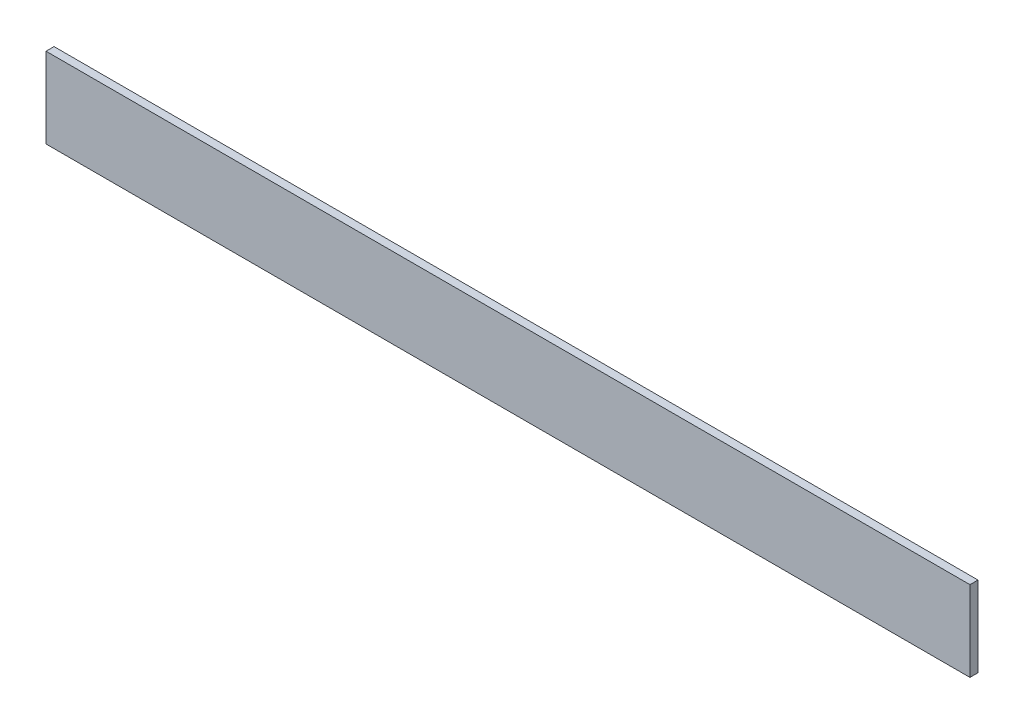
ISO-10303-21;
HEADER;
FILE_DESCRIPTION(('STEP AP214'),'2;1');
FILE_NAME('part.step','',(''),(''),'','','');
FILE_SCHEMA(('AUTOMOTIVE_DESIGN { 1 0 10303 214 1 1 1 1 }'));
ENDSEC;
DATA;
#1=APPLICATION_CONTEXT('core data for automotive mechanical design processes');
#2=APPLICATION_PROTOCOL_DEFINITION('international standard','automotive_design',2000,#1);
#3=PRODUCT_CONTEXT('',#1,'mechanical');
#4=PRODUCT('Part','Part','',(#3));
#5=PRODUCT_RELATED_PRODUCT_CATEGORY('part','',(#4));
#6=PRODUCT_DEFINITION_FORMATION('','',#4);
#7=PRODUCT_DEFINITION_CONTEXT('part definition',#1,'design');
#8=PRODUCT_DEFINITION('design','',#6,#7);
#9=PRODUCT_DEFINITION_SHAPE('','',#8);
#10=(LENGTH_UNIT() NAMED_UNIT(*) SI_UNIT(.MILLI.,.METRE.));
#11=(NAMED_UNIT(*) PLANE_ANGLE_UNIT() SI_UNIT($,.RADIAN.));
#12=(NAMED_UNIT(*) SI_UNIT($,.STERADIAN.) SOLID_ANGLE_UNIT());
#13=UNCERTAINTY_MEASURE_WITH_UNIT(LENGTH_MEASURE(1.E-05),#10,'distance_accuracy_value','');
#14=(GEOMETRIC_REPRESENTATION_CONTEXT(3) GLOBAL_UNCERTAINTY_ASSIGNED_CONTEXT((#13)) GLOBAL_UNIT_ASSIGNED_CONTEXT((#10,
#11,#12)) REPRESENTATION_CONTEXT('',''));
#15=CARTESIAN_POINT('',(0.,0.,0.));
#16=DIRECTION('',(0.,0.,1.));
#17=DIRECTION('',(1.,0.,0.));
#18=AXIS2_PLACEMENT_3D('',#15,#16,#17);
#19=CARTESIAN_POINT('',(0.,50.8,0.));
#20=DIRECTION('',(1.,0.,0.));
#21=DIRECTION('',(0.,0.,-1.));
#22=AXIS2_PLACEMENT_3D('',#19,#20,#21);
#23=PLANE('',#22);
#24=DIRECTION('',(0.,0.,1.));
#25=VECTOR('',#24,1.);
#26=CARTESIAN_POINT('',(0.,0.,0.));
#27=LINE('',#26,#25);
#28=CARTESIAN_POINT('',(0.,0.,-5.08));
#29=VERTEX_POINT('',#28);
#30=CARTESIAN_POINT('',(0.,0.,0.));
#31=VERTEX_POINT('',#30);
#32=EDGE_CURVE('E96',#29,#31,#27,.T.);
#33=ORIENTED_EDGE('',*,*,#32,.T.);
#34=DIRECTION('',(0.,-1.,0.));
#35=VECTOR('',#34,1.);
#36=CARTESIAN_POINT('',(0.,50.8,0.));
#37=LINE('',#36,#35);
#38=CARTESIAN_POINT('',(0.,50.8,0.));
#39=VERTEX_POINT('',#38);
#40=EDGE_CURVE('E11',#39,#31,#37,.T.);
#41=ORIENTED_EDGE('',*,*,#40,.F.);
#42=DIRECTION('',(0.,0.,1.));
#43=VECTOR('',#42,1.);
#44=CARTESIAN_POINT('',(0.,50.8,0.));
#45=LINE('',#44,#43);
#46=CARTESIAN_POINT('',(0.,50.8,-5.08));
#47=VERTEX_POINT('',#46);
#48=EDGE_CURVE('E84',#47,#39,#45,.T.);
#49=ORIENTED_EDGE('',*,*,#48,.F.);
#50=DIRECTION('',(0.,-1.,0.));
#51=VECTOR('',#50,1.);
#52=CARTESIAN_POINT('',(0.,50.8,-5.08));
#53=LINE('',#52,#51);
#54=EDGE_CURVE('E92',#47,#29,#53,.T.);
#55=ORIENTED_EDGE('',*,*,#54,.T.);
#56=EDGE_LOOP('',(#33,#41,#49,#55));
#57=FACE_BOUND('',#56,.T.);
#58=ADVANCED_FACE('F33',(#57),#23,.F.);
#59=CARTESIAN_POINT('',(0.,50.8,0.));
#60=DIRECTION('',(0.,0.,-1.));
#61=DIRECTION('',(-1.,0.,0.));
#62=AXIS2_PLACEMENT_3D('',#59,#60,#61);
#63=PLANE('',#62);
#64=DIRECTION('',(1.,0.,0.));
#65=VECTOR('',#64,1.);
#66=CARTESIAN_POINT('',(0.,0.,0.));
#67=LINE('',#66,#65);
#68=CARTESIAN_POINT('',(584.2,0.,0.));
#69=VERTEX_POINT('',#68);
#70=EDGE_CURVE('E88',#31,#69,#67,.T.);
#71=ORIENTED_EDGE('',*,*,#70,.T.);
#72=DIRECTION('',(0.,-1.,0.));
#73=VECTOR('',#72,1.);
#74=CARTESIAN_POINT('',(584.2,50.8,0.));
#75=LINE('',#74,#73);
#76=CARTESIAN_POINT('',(584.2,50.8,0.));
#77=VERTEX_POINT('',#76);
#78=EDGE_CURVE('E41',#77,#69,#75,.T.);
#79=ORIENTED_EDGE('',*,*,#78,.F.);
#80=DIRECTION('',(1.,0.,0.));
#81=VECTOR('',#80,1.);
#82=CARTESIAN_POINT('',(0.,50.8,0.));
#83=LINE('',#82,#81);
#84=EDGE_CURVE('E79',#39,#77,#83,.T.);
#85=ORIENTED_EDGE('',*,*,#84,.F.);
#86=ORIENTED_EDGE('',*,*,#40,.T.);
#87=EDGE_LOOP('',(#71,#79,#85,#86));
#88=FACE_BOUND('',#87,.T.);
#89=ADVANCED_FACE('F87',(#88),#63,.F.);
#90=CARTESIAN_POINT('',(584.2,50.8,0.));
#91=DIRECTION('',(-1.,0.,0.));
#92=DIRECTION('',(0.,0.,1.));
#93=AXIS2_PLACEMENT_3D('',#90,#91,#92);
#94=PLANE('',#93);
#95=DIRECTION('',(0.,0.,-1.));
#96=VECTOR('',#95,1.);
#97=CARTESIAN_POINT('',(584.2,0.,0.));
#98=LINE('',#97,#96);
#99=CARTESIAN_POINT('',(584.2,0.,-5.08));
#100=VERTEX_POINT('',#99);
#101=EDGE_CURVE('E66',#69,#100,#98,.T.);
#102=ORIENTED_EDGE('',*,*,#101,.T.);
#103=DIRECTION('',(0.,-1.,0.));
#104=VECTOR('',#103,1.);
#105=CARTESIAN_POINT('',(584.2,50.8,-5.08));
#106=LINE('',#105,#104);
#107=CARTESIAN_POINT('',(584.2,50.8,-5.08));
#108=VERTEX_POINT('',#107);
#109=EDGE_CURVE('E89',#108,#100,#106,.T.);
#110=ORIENTED_EDGE('',*,*,#109,.F.);
#111=DIRECTION('',(0.,0.,-1.));
#112=VECTOR('',#111,1.);
#113=CARTESIAN_POINT('',(584.2,50.8,0.));
#114=LINE('',#113,#112);
#115=EDGE_CURVE('E82',#77,#108,#114,.T.);
#116=ORIENTED_EDGE('',*,*,#115,.F.);
#117=ORIENTED_EDGE('',*,*,#78,.T.);
#118=EDGE_LOOP('',(#102,#110,#116,#117));
#119=FACE_BOUND('',#118,.T.);
#120=ADVANCED_FACE('F90',(#119),#94,.F.);
#121=CARTESIAN_POINT('',(0.,50.8,-5.08));
#122=DIRECTION('',(0.,0.,1.));
#123=DIRECTION('',(1.,0.,0.));
#124=AXIS2_PLACEMENT_3D('',#121,#122,#123);
#125=PLANE('',#124);
#126=DIRECTION('',(-1.,0.,0.));
#127=VECTOR('',#126,1.);
#128=CARTESIAN_POINT('',(0.,0.,-5.08));
#129=LINE('',#128,#127);
#130=EDGE_CURVE('E72',#100,#29,#129,.T.);
#131=ORIENTED_EDGE('',*,*,#130,.T.);
#132=ORIENTED_EDGE('',*,*,#54,.F.);
#133=DIRECTION('',(-1.,0.,0.));
#134=VECTOR('',#133,1.);
#135=CARTESIAN_POINT('',(0.,50.8,-5.08));
#136=LINE('',#135,#134);
#137=EDGE_CURVE('E49',#108,#47,#136,.T.);
#138=ORIENTED_EDGE('',*,*,#137,.F.);
#139=ORIENTED_EDGE('',*,*,#109,.T.);
#140=EDGE_LOOP('',(#131,#132,#138,#139));
#141=FACE_BOUND('',#140,.T.);
#142=ADVANCED_FACE('F103',(#141),#125,.F.);
#143=CARTESIAN_POINT('',(0.,50.8,0.));
#144=DIRECTION('',(0.,-1.,0.));
#145=DIRECTION('',(0.,0.,-1.));
#146=AXIS2_PLACEMENT_3D('',#143,#144,#145);
#147=PLANE('',#146);
#148=ORIENTED_EDGE('',*,*,#48,.T.);
#149=ORIENTED_EDGE('',*,*,#84,.T.);
#150=ORIENTED_EDGE('',*,*,#115,.T.);
#151=ORIENTED_EDGE('',*,*,#137,.T.);
#152=EDGE_LOOP('',(#148,#149,#150,#151));
#153=FACE_BOUND('',#152,.T.);
#154=ADVANCED_FACE('F80',(#153),#147,.F.);
#155=CARTESIAN_POINT('',(0.,0.,0.));
#156=DIRECTION('',(0.,-1.,0.));
#157=DIRECTION('',(0.,0.,-1.));
#158=AXIS2_PLACEMENT_3D('',#155,#156,#157);
#159=PLANE('',#158);
#160=ORIENTED_EDGE('',*,*,#32,.F.);
#161=ORIENTED_EDGE('',*,*,#130,.F.);
#162=ORIENTED_EDGE('',*,*,#101,.F.);
#163=ORIENTED_EDGE('',*,*,#70,.F.);
#164=EDGE_LOOP('',(#160,#161,#162,#163));
#165=FACE_BOUND('',#164,.T.);
#166=ADVANCED_FACE('F106',(#165),#159,.T.);
#167=CLOSED_SHELL('',(#58,#89,#120,#142,#154,#166));
#168=MANIFOLD_SOLID_BREP('B2',#167);
#169=ADVANCED_BREP_SHAPE_REPRESENTATION('',(#18,#168),#14);
#170=SHAPE_DEFINITION_REPRESENTATION(#9,#169);
ENDSEC;
END-ISO-10303-21;
